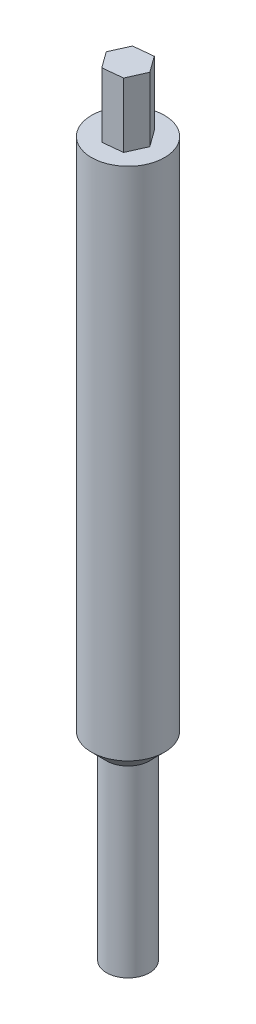
ISO-10303-21;
HEADER;
FILE_DESCRIPTION(('STEP AP214'),'2;1');
FILE_NAME('part.step','',(''),(''),'','','');
FILE_SCHEMA(('AUTOMOTIVE_DESIGN { 1 0 10303 214 1 1 1 1 }'));
ENDSEC;
DATA;
#1=APPLICATION_CONTEXT('core data for automotive mechanical design processes');
#2=APPLICATION_PROTOCOL_DEFINITION('international standard','automotive_design',2000,#1);
#3=PRODUCT_CONTEXT('',#1,'mechanical');
#4=PRODUCT('Part','Part','',(#3));
#5=PRODUCT_RELATED_PRODUCT_CATEGORY('part','',(#4));
#6=PRODUCT_DEFINITION_FORMATION('','',#4);
#7=PRODUCT_DEFINITION_CONTEXT('part definition',#1,'design');
#8=PRODUCT_DEFINITION('design','',#6,#7);
#9=PRODUCT_DEFINITION_SHAPE('','',#8);
#10=(LENGTH_UNIT() NAMED_UNIT(*) SI_UNIT(.MILLI.,.METRE.));
#11=(NAMED_UNIT(*) PLANE_ANGLE_UNIT() SI_UNIT($,.RADIAN.));
#12=(NAMED_UNIT(*) SI_UNIT($,.STERADIAN.) SOLID_ANGLE_UNIT());
#13=UNCERTAINTY_MEASURE_WITH_UNIT(LENGTH_MEASURE(1.E-05),#10,'distance_accuracy_value','');
#14=(GEOMETRIC_REPRESENTATION_CONTEXT(3) GLOBAL_UNCERTAINTY_ASSIGNED_CONTEXT((#13)) GLOBAL_UNIT_ASSIGNED_CONTEXT((#10,
#11,#12)) REPRESENTATION_CONTEXT('',''));
#15=CARTESIAN_POINT('',(0.,0.,0.));
#16=DIRECTION('',(0.,0.,1.));
#17=DIRECTION('',(1.,0.,0.));
#18=AXIS2_PLACEMENT_3D('',#15,#16,#17);
#19=CARTESIAN_POINT('',(0.,210.82,0.));
#20=DIRECTION('',(0.,1.,0.));
#21=DIRECTION('',(0.,0.,1.));
#22=AXIS2_PLACEMENT_3D('',#19,#20,#21);
#23=PLANE('',#22);
#24=CARTESIAN_POINT('',(0.,210.82,0.));
#25=DIRECTION('',(0.,1.,0.));
#26=DIRECTION('',(0.,0.,1.));
#27=AXIS2_PLACEMENT_3D('',#24,#25,#26);
#28=CIRCLE('',#27,10.795);
#29=CARTESIAN_POINT('',(0.,210.82,10.795));
#30=VERTEX_POINT('',#29);
#31=EDGE_CURVE('E39',#30,#30,#28,.F.);
#32=ORIENTED_EDGE('',*,*,#31,.F.);
#33=EDGE_LOOP('',(#32));
#34=FACE_BOUND('',#33,.T.);
#35=DIRECTION('',(-0.40887313489338,0.,0.912591233555561));
#36=VECTOR('',#35,1.);
#37=CARTESIAN_POINT('',(-3.43676335282714,210.82,-4.75365028057362));
#38=LINE('',#37,#36);
#39=CARTESIAN_POINT('',(-3.43676335282714,210.82,-4.75365028057362));
#40=VERTEX_POINT('',#39);
#41=CARTESIAN_POINT('',(-5.83516358009735,210.82,0.599499230056878));
#42=VERTEX_POINT('',#41);
#43=EDGE_CURVE('E123',#40,#42,#38,.T.);
#44=ORIENTED_EDGE('',*,*,#43,.F.);
#45=DIRECTION('',(-0.994763758976783,0.,0.102201095035131));
#46=VECTOR('',#45,1.);
#47=CARTESIAN_POINT('',(2.39840022727021,210.82,-5.3531495106305));
#48=LINE('',#47,#46);
#49=CARTESIAN_POINT('',(2.39840022727021,210.82,-5.3531495106305));
#50=VERTEX_POINT('',#49);
#51=EDGE_CURVE('E120',#50,#40,#48,.T.);
#52=ORIENTED_EDGE('',*,*,#51,.F.);
#53=DIRECTION('',(-0.585890624083403,0.,-0.810390138520429));
#54=VECTOR('',#53,1.);
#55=CARTESIAN_POINT('',(5.83516358009735,210.82,-0.599499230056876));
#56=LINE('',#55,#54);
#57=CARTESIAN_POINT('',(5.83516358009735,210.82,-0.599499230056876));
#58=VERTEX_POINT('',#57);
#59=EDGE_CURVE('E79',#58,#50,#56,.T.);
#60=ORIENTED_EDGE('',*,*,#59,.F.);
#61=DIRECTION('',(0.40887313489338,0.,-0.912591233555561));
#62=VECTOR('',#61,1.);
#63=CARTESIAN_POINT('',(3.43676335282714,210.82,4.75365028057362));
#64=LINE('',#63,#62);
#65=CARTESIAN_POINT('',(3.43676335282714,210.82,4.75365028057362));
#66=VERTEX_POINT('',#65);
#67=EDGE_CURVE('E128',#66,#58,#64,.T.);
#68=ORIENTED_EDGE('',*,*,#67,.F.);
#69=DIRECTION('',(0.994763758976783,0.,-0.102201095035131));
#70=VECTOR('',#69,1.);
#71=CARTESIAN_POINT('',(-2.39840022727021,210.82,5.3531495106305));
#72=LINE('',#71,#70);
#73=CARTESIAN_POINT('',(-2.39840022727021,210.82,5.3531495106305));
#74=VERTEX_POINT('',#73);
#75=EDGE_CURVE('E109',#74,#66,#72,.T.);
#76=ORIENTED_EDGE('',*,*,#75,.F.);
#77=DIRECTION('',(0.585890624083403,0.,0.810390138520429));
#78=VECTOR('',#77,1.);
#79=CARTESIAN_POINT('',(-5.83516358009735,210.82,0.599499230056878));
#80=LINE('',#79,#78);
#81=EDGE_CURVE('E125',#42,#74,#80,.T.);
#82=ORIENTED_EDGE('',*,*,#81,.F.);
#83=EDGE_LOOP('',(#44,#52,#60,#68,#76,#82));
#84=FACE_BOUND('',#83,.T.);
#85=ADVANCED_FACE('F35',(#34,#84),#23,.T.);
#86=CARTESIAN_POINT('',(0.,421.64,0.));
#87=DIRECTION('',(0.,-1.,0.));
#88=DIRECTION('',(0.,0.,-1.));
#89=AXIS2_PLACEMENT_3D('',#86,#87,#88);
#90=CYLINDRICAL_SURFACE('',#89,10.795);
#91=CARTESIAN_POINT('',(0.,58.6740000000001,0.));
#92=DIRECTION('',(0.,-1.,0.));
#93=DIRECTION('',(0.,0.,-1.));
#94=AXIS2_PLACEMENT_3D('',#91,#92,#93);
#95=CIRCLE('',#94,10.795);
#96=CARTESIAN_POINT('',(0.,58.6740000000001,-10.795));
#97=VERTEX_POINT('',#96);
#98=EDGE_CURVE('E44',#97,#97,#95,.F.);
#99=ORIENTED_EDGE('',*,*,#98,.T.);
#100=EDGE_LOOP('',(#99));
#101=FACE_BOUND('',#100,.T.);
#102=ORIENTED_EDGE('',*,*,#31,.T.);
#103=EDGE_LOOP('',(#102));
#104=FACE_BOUND('',#103,.T.);
#105=ADVANCED_FACE('F146',(#101,#104),#90,.T.);
#106=CARTESIAN_POINT('',(0.,52.324,0.));
#107=DIRECTION('',(0.,-1.,0.));
#108=DIRECTION('',(0.,0.,-1.));
#109=AXIS2_PLACEMENT_3D('',#106,#107,#108);
#110=CYLINDRICAL_SURFACE('',#109,6.35);
#111=CARTESIAN_POINT('',(0.,54.2290000000001,0.));
#112=DIRECTION('',(0.,1.,0.));
#113=DIRECTION('',(0.,0.,1.));
#114=AXIS2_PLACEMENT_3D('',#111,#112,#113);
#115=CIRCLE('',#114,6.35);
#116=CARTESIAN_POINT('',(0.,54.2290000000001,6.35));
#117=VERTEX_POINT('',#116);
#118=EDGE_CURVE('E11',#117,#117,#115,.F.);
#119=ORIENTED_EDGE('',*,*,#118,.T.);
#120=EDGE_LOOP('',(#119));
#121=FACE_BOUND('',#120,.T.);
#122=CARTESIAN_POINT('',(0.,0.,0.));
#123=DIRECTION('',(0.,-1.,0.));
#124=DIRECTION('',(0.,0.,-1.));
#125=AXIS2_PLACEMENT_3D('',#122,#123,#124);
#126=CIRCLE('',#125,6.35);
#127=CARTESIAN_POINT('',(0.,0.,-6.35));
#128=VERTEX_POINT('',#127);
#129=EDGE_CURVE('E140',#128,#128,#126,.T.);
#130=ORIENTED_EDGE('',*,*,#129,.F.);
#131=EDGE_LOOP('',(#130));
#132=FACE_BOUND('',#131,.T.);
#133=ADVANCED_FACE('F160',(#121,#132),#110,.T.);
#134=CARTESIAN_POINT('',(0.,0.,0.));
#135=DIRECTION('',(0.,1.,0.));
#136=DIRECTION('',(0.,0.,1.));
#137=AXIS2_PLACEMENT_3D('',#134,#135,#136);
#138=PLANE('',#137);
#139=ORIENTED_EDGE('',*,*,#129,.T.);
#140=EDGE_LOOP('',(#139));
#141=FACE_BOUND('',#140,.T.);
#142=ADVANCED_FACE('F151',(#141),#138,.F.);
#143=CARTESIAN_POINT('',(0.,58.6740000000001,0.));
#144=DIRECTION('',(0.,1.,0.));
#145=DIRECTION('',(0.,0.,1.));
#146=AXIS2_PLACEMENT_3D('',#143,#144,#145);
#147=CONICAL_SURFACE('',#146,10.795,0.785398163397451);
#148=ORIENTED_EDGE('',*,*,#118,.F.);
#149=EDGE_LOOP('',(#148));
#150=FACE_BOUND('',#149,.T.);
#151=ORIENTED_EDGE('',*,*,#98,.F.);
#152=EDGE_LOOP('',(#151));
#153=FACE_BOUND('',#152,.T.);
#154=ADVANCED_FACE('F37',(#150,#153),#147,.T.);
#155=CARTESIAN_POINT('',(2.39840022727021,229.87,-5.3531495106305));
#156=DIRECTION('',(0.102201095035131,0.,0.994763758976783));
#157=DIRECTION('',(0.994763758976784,0.,-0.102201095035131));
#158=AXIS2_PLACEMENT_3D('',#155,#156,#157);
#159=PLANE('',#158);
#160=ORIENTED_EDGE('',*,*,#51,.T.);
#161=DIRECTION('',(0.,-1.,0.));
#162=VECTOR('',#161,1.);
#163=CARTESIAN_POINT('',(-3.43676335282714,229.87,-4.75365028057362));
#164=LINE('',#163,#162);
#165=CARTESIAN_POINT('',(-3.43676335282714,229.87,-4.75365028057362));
#166=VERTEX_POINT('',#165);
#167=EDGE_CURVE('E138',#166,#40,#164,.T.);
#168=ORIENTED_EDGE('',*,*,#167,.F.);
#169=DIRECTION('',(-0.994763758976783,0.,0.102201095035131));
#170=VECTOR('',#169,1.);
#171=CARTESIAN_POINT('',(2.39840022727021,229.87,-5.3531495106305));
#172=LINE('',#171,#170);
#173=CARTESIAN_POINT('',(2.39840022727021,229.87,-5.3531495106305));
#174=VERTEX_POINT('',#173);
#175=EDGE_CURVE('E131',#174,#166,#172,.T.);
#176=ORIENTED_EDGE('',*,*,#175,.F.);
#177=DIRECTION('',(0.,-1.,0.));
#178=VECTOR('',#177,1.);
#179=CARTESIAN_POINT('',(2.39840022727021,229.87,-5.3531495106305));
#180=LINE('',#179,#178);
#181=EDGE_CURVE('E116',#174,#50,#180,.T.);
#182=ORIENTED_EDGE('',*,*,#181,.T.);
#183=EDGE_LOOP('',(#160,#168,#176,#182));
#184=FACE_BOUND('',#183,.T.);
#185=ADVANCED_FACE('F150',(#184),#159,.F.);
#186=CARTESIAN_POINT('',(-3.43676335282714,229.87,-4.75365028057362));
#187=DIRECTION('',(0.912591233555561,0.,0.40887313489338));
#188=DIRECTION('',(0.40887313489338,0.,-0.912591233555561));
#189=AXIS2_PLACEMENT_3D('',#186,#187,#188);
#190=PLANE('',#189);
#191=ORIENTED_EDGE('',*,*,#43,.T.);
#192=DIRECTION('',(0.,-1.,0.));
#193=VECTOR('',#192,1.);
#194=CARTESIAN_POINT('',(-5.83516358009735,229.87,0.599499230056878));
#195=LINE('',#194,#193);
#196=CARTESIAN_POINT('',(-5.83516358009735,229.87,0.599499230056878));
#197=VERTEX_POINT('',#196);
#198=EDGE_CURVE('E135',#197,#42,#195,.T.);
#199=ORIENTED_EDGE('',*,*,#198,.F.);
#200=DIRECTION('',(-0.40887313489338,0.,0.912591233555561));
#201=VECTOR('',#200,1.);
#202=CARTESIAN_POINT('',(-3.43676335282714,229.87,-4.75365028057362));
#203=LINE('',#202,#201);
#204=EDGE_CURVE('E87',#166,#197,#203,.T.);
#205=ORIENTED_EDGE('',*,*,#204,.F.);
#206=ORIENTED_EDGE('',*,*,#167,.T.);
#207=EDGE_LOOP('',(#191,#199,#205,#206));
#208=FACE_BOUND('',#207,.T.);
#209=ADVANCED_FACE('F157',(#208),#190,.F.);
#210=CARTESIAN_POINT('',(-5.83516358009735,229.87,0.599499230056878));
#211=DIRECTION('',(0.810390138520429,0.,-0.585890624083403));
#212=DIRECTION('',(-0.585890624083403,0.,-0.810390138520429));
#213=AXIS2_PLACEMENT_3D('',#210,#211,#212);
#214=PLANE('',#213);
#215=ORIENTED_EDGE('',*,*,#81,.T.);
#216=DIRECTION('',(0.,-1.,0.));
#217=VECTOR('',#216,1.);
#218=CARTESIAN_POINT('',(-2.39840022727021,229.87,5.3531495106305));
#219=LINE('',#218,#217);
#220=CARTESIAN_POINT('',(-2.39840022727021,229.87,5.3531495106305));
#221=VERTEX_POINT('',#220);
#222=EDGE_CURVE('E112',#221,#74,#219,.T.);
#223=ORIENTED_EDGE('',*,*,#222,.F.);
#224=DIRECTION('',(0.585890624083403,0.,0.810390138520429));
#225=VECTOR('',#224,1.);
#226=CARTESIAN_POINT('',(-5.83516358009735,229.87,0.599499230056878));
#227=LINE('',#226,#225);
#228=EDGE_CURVE('E100',#197,#221,#227,.T.);
#229=ORIENTED_EDGE('',*,*,#228,.F.);
#230=ORIENTED_EDGE('',*,*,#198,.T.);
#231=EDGE_LOOP('',(#215,#223,#229,#230));
#232=FACE_BOUND('',#231,.T.);
#233=ADVANCED_FACE('F218',(#232),#214,.F.);
#234=CARTESIAN_POINT('',(-2.39840022727021,229.87,5.3531495106305));
#235=DIRECTION('',(-0.102201095035131,0.,-0.994763758976783));
#236=DIRECTION('',(-0.994763758976784,0.,0.102201095035131));
#237=AXIS2_PLACEMENT_3D('',#234,#235,#236);
#238=PLANE('',#237);
#239=ORIENTED_EDGE('',*,*,#75,.T.);
#240=DIRECTION('',(0.,-1.,0.));
#241=VECTOR('',#240,1.);
#242=CARTESIAN_POINT('',(3.43676335282714,229.87,4.75365028057362));
#243=LINE('',#242,#241);
#244=CARTESIAN_POINT('',(3.43676335282714,229.87,4.75365028057362));
#245=VERTEX_POINT('',#244);
#246=EDGE_CURVE('E106',#245,#66,#243,.T.);
#247=ORIENTED_EDGE('',*,*,#246,.F.);
#248=DIRECTION('',(0.994763758976783,0.,-0.102201095035131));
#249=VECTOR('',#248,1.);
#250=CARTESIAN_POINT('',(-2.39840022727021,229.87,5.3531495106305));
#251=LINE('',#250,#249);
#252=EDGE_CURVE('E94',#221,#245,#251,.T.);
#253=ORIENTED_EDGE('',*,*,#252,.F.);
#254=ORIENTED_EDGE('',*,*,#222,.T.);
#255=EDGE_LOOP('',(#239,#247,#253,#254));
#256=FACE_BOUND('',#255,.T.);
#257=ADVANCED_FACE('F107',(#256),#238,.F.);
#258=CARTESIAN_POINT('',(3.43676335282714,229.87,4.75365028057362));
#259=DIRECTION('',(-0.91259123355556,0.,-0.40887313489338));
#260=DIRECTION('',(-0.40887313489338,0.,0.912591233555561));
#261=AXIS2_PLACEMENT_3D('',#258,#259,#260);
#262=PLANE('',#261);
#263=ORIENTED_EDGE('',*,*,#67,.T.);
#264=DIRECTION('',(0.,-1.,0.));
#265=VECTOR('',#264,1.);
#266=CARTESIAN_POINT('',(5.83516358009735,229.87,-0.599499230056876));
#267=LINE('',#266,#265);
#268=CARTESIAN_POINT('',(5.83516358009735,229.87,-0.599499230056876));
#269=VERTEX_POINT('',#268);
#270=EDGE_CURVE('E51',#269,#58,#267,.T.);
#271=ORIENTED_EDGE('',*,*,#270,.F.);
#272=DIRECTION('',(0.40887313489338,0.,-0.912591233555561));
#273=VECTOR('',#272,1.);
#274=CARTESIAN_POINT('',(3.43676335282714,229.87,4.75365028057362));
#275=LINE('',#274,#273);
#276=EDGE_CURVE('E98',#245,#269,#275,.T.);
#277=ORIENTED_EDGE('',*,*,#276,.F.);
#278=ORIENTED_EDGE('',*,*,#246,.T.);
#279=EDGE_LOOP('',(#263,#271,#277,#278));
#280=FACE_BOUND('',#279,.T.);
#281=ADVANCED_FACE('F114',(#280),#262,.F.);
#282=CARTESIAN_POINT('',(5.83516358009735,229.87,-0.599499230056876));
#283=DIRECTION('',(-0.810390138520429,0.,0.585890624083403));
#284=DIRECTION('',(0.585890624083403,0.,0.810390138520429));
#285=AXIS2_PLACEMENT_3D('',#282,#283,#284);
#286=PLANE('',#285);
#287=ORIENTED_EDGE('',*,*,#59,.T.);
#288=ORIENTED_EDGE('',*,*,#181,.F.);
#289=DIRECTION('',(-0.585890624083403,0.,-0.810390138520429));
#290=VECTOR('',#289,1.);
#291=CARTESIAN_POINT('',(5.83516358009735,229.87,-0.599499230056876));
#292=LINE('',#291,#290);
#293=EDGE_CURVE('E59',#269,#174,#292,.T.);
#294=ORIENTED_EDGE('',*,*,#293,.F.);
#295=ORIENTED_EDGE('',*,*,#270,.T.);
#296=EDGE_LOOP('',(#287,#288,#294,#295));
#297=FACE_BOUND('',#296,.T.);
#298=ADVANCED_FACE('F240',(#297),#286,.F.);
#299=CARTESIAN_POINT('',(0.,229.87,0.));
#300=DIRECTION('',(0.,1.,0.));
#301=DIRECTION('',(0.,0.,1.));
#302=AXIS2_PLACEMENT_3D('',#299,#300,#301);
#303=PLANE('',#302);
#304=ORIENTED_EDGE('',*,*,#175,.T.);
#305=ORIENTED_EDGE('',*,*,#204,.T.);
#306=ORIENTED_EDGE('',*,*,#228,.T.);
#307=ORIENTED_EDGE('',*,*,#252,.T.);
#308=ORIENTED_EDGE('',*,*,#276,.T.);
#309=ORIENTED_EDGE('',*,*,#293,.T.);
#310=EDGE_LOOP('',(#304,#305,#306,#307,#308,#309));
#311=FACE_BOUND('',#310,.T.);
#312=ADVANCED_FACE('F96',(#311),#303,.T.);
#313=CLOSED_SHELL('',(#85,#105,#133,#142,#154,#185,#209,#233,#257,#281,#298,#312));
#314=MANIFOLD_SOLID_BREP('B2',#313);
#315=ADVANCED_BREP_SHAPE_REPRESENTATION('',(#18,#314),#14);
#316=SHAPE_DEFINITION_REPRESENTATION(#9,#315);
ENDSEC;
END-ISO-10303-21;
